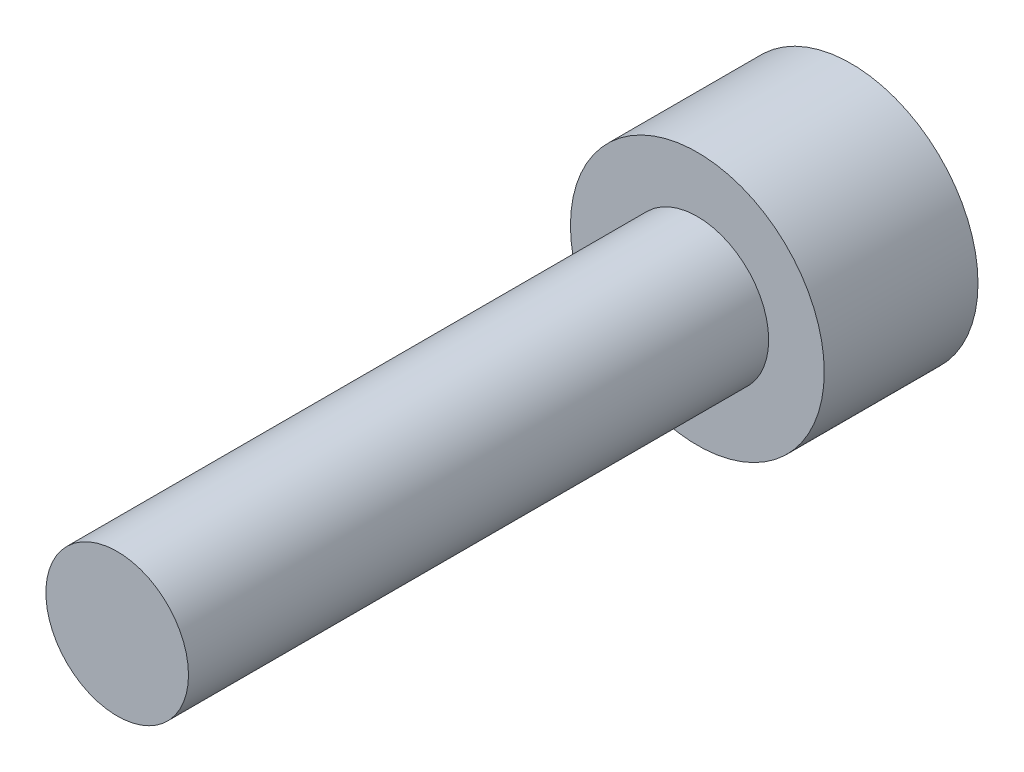
ISO-10303-21;
HEADER;
FILE_DESCRIPTION(('STEP AP214'),'2;1');
FILE_NAME('part.step','',(''),(''),'','','');
FILE_SCHEMA(('AUTOMOTIVE_DESIGN { 1 0 10303 214 1 1 1 1 }'));
ENDSEC;
DATA;
#1=APPLICATION_CONTEXT('core data for automotive mechanical design processes');
#2=APPLICATION_PROTOCOL_DEFINITION('international standard','automotive_design',2000,#1);
#3=PRODUCT_CONTEXT('',#1,'mechanical');
#4=PRODUCT('Part','Part','',(#3));
#5=PRODUCT_RELATED_PRODUCT_CATEGORY('part','',(#4));
#6=PRODUCT_DEFINITION_FORMATION('','',#4);
#7=PRODUCT_DEFINITION_CONTEXT('part definition',#1,'design');
#8=PRODUCT_DEFINITION('design','',#6,#7);
#9=PRODUCT_DEFINITION_SHAPE('','',#8);
#10=(LENGTH_UNIT() NAMED_UNIT(*) SI_UNIT(.MILLI.,.METRE.));
#11=(NAMED_UNIT(*) PLANE_ANGLE_UNIT() SI_UNIT($,.RADIAN.));
#12=(NAMED_UNIT(*) SI_UNIT($,.STERADIAN.) SOLID_ANGLE_UNIT());
#13=UNCERTAINTY_MEASURE_WITH_UNIT(LENGTH_MEASURE(1.E-05),#10,'distance_accuracy_value','');
#14=(GEOMETRIC_REPRESENTATION_CONTEXT(3) GLOBAL_UNCERTAINTY_ASSIGNED_CONTEXT((#13)) GLOBAL_UNIT_ASSIGNED_CONTEXT((#10,
#11,#12)) REPRESENTATION_CONTEXT('',''));
#15=CARTESIAN_POINT('',(0.,0.,0.));
#16=DIRECTION('',(0.,0.,1.));
#17=DIRECTION('',(1.,0.,0.));
#18=AXIS2_PLACEMENT_3D('',#15,#16,#17);
#19=CARTESIAN_POINT('',(0.,0.,3.18));
#20=DIRECTION('',(0.,0.,-1.));
#21=DIRECTION('',(-1.,0.,0.));
#22=AXIS2_PLACEMENT_3D('',#19,#20,#21);
#23=CYLINDRICAL_SURFACE('',#22,2.625);
#24=CARTESIAN_POINT('',(0.,0.,3.18));
#25=DIRECTION('',(0.,0.,1.));
#26=DIRECTION('',(1.,0.,0.));
#27=AXIS2_PLACEMENT_3D('',#24,#25,#26);
#28=CIRCLE('',#27,2.625);
#29=CARTESIAN_POINT('',(-2.625,0.,3.18));
#30=VERTEX_POINT('',#29);
#31=EDGE_CURVE('E42',#30,#30,#28,.T.);
#32=CARTESIAN_POINT('',(0.,0.,0.));
#33=DIRECTION('',(0.,0.,1.));
#34=DIRECTION('',(1.,0.,0.));
#35=AXIS2_PLACEMENT_3D('',#32,#33,#34);
#36=CIRCLE('',#35,2.625);
#37=CARTESIAN_POINT('',(-2.625,0.,0.));
#38=VERTEX_POINT('',#37);
#39=EDGE_CURVE('E38',#38,#38,#36,.T.);
#40=CARTESIAN_POINT('',(-2.625,0.,3.18));
#41=CARTESIAN_POINT('',(-2.625,0.,3.146875));
#42=CARTESIAN_POINT('',(-2.625,0.,3.11375));
#43=CARTESIAN_POINT('',(-2.625,0.,3.0475));
#44=CARTESIAN_POINT('',(-2.625,0.,3.014375));
#45=CARTESIAN_POINT('',(-2.625,0.,2.948125));
#46=CARTESIAN_POINT('',(-2.625,0.,2.915));
#47=CARTESIAN_POINT('',(-2.625,0.,2.84875));
#48=CARTESIAN_POINT('',(-2.625,0.,2.815625));
#49=CARTESIAN_POINT('',(-2.625,0.,2.749375));
#50=CARTESIAN_POINT('',(-2.625,0.,2.71625));
#51=CARTESIAN_POINT('',(-2.625,0.,2.65));
#52=CARTESIAN_POINT('',(-2.625,0.,2.616875));
#53=CARTESIAN_POINT('',(-2.625,0.,2.550625));
#54=CARTESIAN_POINT('',(-2.625,0.,2.5175));
#55=CARTESIAN_POINT('',(-2.625,0.,2.45125));
#56=CARTESIAN_POINT('',(-2.625,0.,2.418125));
#57=CARTESIAN_POINT('',(-2.625,0.,2.351875));
#58=CARTESIAN_POINT('',(-2.625,0.,2.31875));
#59=CARTESIAN_POINT('',(-2.625,0.,2.2525));
#60=CARTESIAN_POINT('',(-2.625,0.,2.219375));
#61=CARTESIAN_POINT('',(-2.625,0.,2.153125));
#62=CARTESIAN_POINT('',(-2.625,0.,2.12));
#63=CARTESIAN_POINT('',(-2.625,0.,2.05375));
#64=CARTESIAN_POINT('',(-2.625,0.,2.020625));
#65=CARTESIAN_POINT('',(-2.625,0.,1.954375));
#66=CARTESIAN_POINT('',(-2.625,0.,1.92125));
#67=CARTESIAN_POINT('',(-2.625,0.,1.855));
#68=CARTESIAN_POINT('',(-2.625,0.,1.821875));
#69=CARTESIAN_POINT('',(-2.625,0.,1.755625));
#70=CARTESIAN_POINT('',(-2.625,0.,1.7225));
#71=CARTESIAN_POINT('',(-2.625,0.,1.65625));
#72=CARTESIAN_POINT('',(-2.625,0.,1.623125));
#73=CARTESIAN_POINT('',(-2.625,0.,1.556875));
#74=CARTESIAN_POINT('',(-2.625,0.,1.52375));
#75=CARTESIAN_POINT('',(-2.625,0.,1.4575));
#76=CARTESIAN_POINT('',(-2.625,0.,1.424375));
#77=CARTESIAN_POINT('',(-2.625,0.,1.358125));
#78=CARTESIAN_POINT('',(-2.625,0.,1.325));
#79=CARTESIAN_POINT('',(-2.625,0.,1.25875));
#80=CARTESIAN_POINT('',(-2.625,0.,1.225625));
#81=CARTESIAN_POINT('',(-2.625,0.,1.159375));
#82=CARTESIAN_POINT('',(-2.625,0.,1.12625));
#83=CARTESIAN_POINT('',(-2.625,0.,1.06));
#84=CARTESIAN_POINT('',(-2.625,0.,1.026875));
#85=CARTESIAN_POINT('',(-2.625,0.,0.960625));
#86=CARTESIAN_POINT('',(-2.625,0.,0.9275));
#87=CARTESIAN_POINT('',(-2.625,0.,0.86125));
#88=CARTESIAN_POINT('',(-2.625,0.,0.828125));
#89=CARTESIAN_POINT('',(-2.625,0.,0.761875));
#90=CARTESIAN_POINT('',(-2.625,0.,0.72875));
#91=CARTESIAN_POINT('',(-2.625,0.,0.6625));
#92=CARTESIAN_POINT('',(-2.625,0.,0.629375));
#93=CARTESIAN_POINT('',(-2.625,0.,0.563125));
#94=CARTESIAN_POINT('',(-2.625,0.,0.53));
#95=CARTESIAN_POINT('',(-2.625,0.,0.46375));
#96=CARTESIAN_POINT('',(-2.625,0.,0.430625));
#97=CARTESIAN_POINT('',(-2.625,0.,0.364375));
#98=CARTESIAN_POINT('',(-2.625,0.,0.33125));
#99=CARTESIAN_POINT('',(-2.625,0.,0.265));
#100=CARTESIAN_POINT('',(-2.625,0.,0.231875));
#101=CARTESIAN_POINT('',(-2.625,0.,0.165625));
#102=CARTESIAN_POINT('',(-2.625,0.,0.1325));
#103=CARTESIAN_POINT('',(-2.625,0.,0.06625));
#104=CARTESIAN_POINT('',(-2.625,0.,0.033125));
#105=CARTESIAN_POINT('',(-2.625,0.,0.));
#106=B_SPLINE_CURVE_WITH_KNOTS('',3,(#40,#41,#42,#43,#44,#45,#46,#47,#48,#49,#50,#51,#52,#53,
#54,#55,#56,#57,#58,#59,#60,#61,#62,#63,#64,#65,#66,#67,#68,#69,#70,#71,#72,#73,#74,#75,#76,#77,
#78,#79,#80,#81,#82,#83,#84,#85,#86,#87,#88,#89,#90,#91,#92,#93,#94,#95,#96,#97,#98,#99,#100,
#101,#102,#103,#104,#105),.UNSPECIFIED.,.F.,.F.,(4,2,2,2,2,2,2,2,2,2,2,2,2,2,2,2,2,2,2,2,2,2,2,
2,2,2,2,2,2,2,2,2,4),(0.,0.0993749999999996,0.19875,0.298125,0.3975,0.496875,0.59625,0.695625,
0.795,0.894375,0.99375,1.093125,1.1925,1.291875,1.39125,1.490625,1.59,1.689375,1.78875,1.888125,
1.9875,2.086875,2.18625,2.285625,2.385,2.484375,2.58375,2.683125,2.7825,2.881875,2.98125,
3.080625,3.18),.UNSPECIFIED.);
#107=EDGE_CURVE('BSEAM35',#30,#38,#106,.T.);
#108=ORIENTED_EDGE('',*,*,#31,.F.);
#109=ORIENTED_EDGE('',*,*,#39,.T.);
#110=ORIENTED_EDGE('',*,*,#107,.T.);
#111=ORIENTED_EDGE('',*,*,#107,.F.);
#112=EDGE_LOOP('',(#108,#110,#109,#111));
#113=FACE_BOUND('',#112,.T.);
#114=ADVANCED_FACE('F35',(#113),#23,.T.);
#115=CARTESIAN_POINT('',(0.,0.,3.18));
#116=DIRECTION('',(0.,0.,1.));
#117=DIRECTION('',(1.,0.,0.));
#118=AXIS2_PLACEMENT_3D('',#115,#116,#117);
#119=PLANE('',#118);
#120=CARTESIAN_POINT('',(0.,0.,3.18));
#121=DIRECTION('',(0.,0.,1.));
#122=DIRECTION('',(1.,0.,0.));
#123=AXIS2_PLACEMENT_3D('',#120,#121,#122);
#124=CIRCLE('',#123,1.475);
#125=CARTESIAN_POINT('',(1.475,0.,3.18));
#126=VERTEX_POINT('',#125);
#127=EDGE_CURVE('E10',#126,#126,#124,.T.);
#128=ORIENTED_EDGE('',*,*,#127,.F.);
#129=EDGE_LOOP('',(#128));
#130=FACE_BOUND('',#129,.T.);
#131=ORIENTED_EDGE('',*,*,#31,.T.);
#132=EDGE_LOOP('',(#131));
#133=FACE_BOUND('',#132,.T.);
#134=ADVANCED_FACE('F59',(#130,#133),#119,.T.);
#135=CARTESIAN_POINT('',(0.,0.,0.));
#136=DIRECTION('',(0.,0.,1.));
#137=DIRECTION('',(1.,0.,0.));
#138=AXIS2_PLACEMENT_3D('',#135,#136,#137);
#139=PLANE('',#138);
#140=ORIENTED_EDGE('',*,*,#39,.F.);
#141=EDGE_LOOP('',(#140));
#142=FACE_BOUND('',#141,.T.);
#143=ADVANCED_FACE('F56',(#142),#139,.F.);
#144=CARTESIAN_POINT('',(0.,0.,15.18));
#145=DIRECTION('',(0.,0.,-1.));
#146=DIRECTION('',(-1.,0.,0.));
#147=AXIS2_PLACEMENT_3D('',#144,#145,#146);
#148=CYLINDRICAL_SURFACE('',#147,1.475);
#149=CARTESIAN_POINT('',(0.,0.,15.18));
#150=DIRECTION('',(0.,0.,1.));
#151=DIRECTION('',(1.,0.,0.));
#152=AXIS2_PLACEMENT_3D('',#149,#150,#151);
#153=CIRCLE('',#152,1.475);
#154=CARTESIAN_POINT('',(1.475,0.,15.18));
#155=VERTEX_POINT('',#154);
#156=EDGE_CURVE('E48',#155,#155,#153,.T.);
#157=ORIENTED_EDGE('',*,*,#156,.F.);
#158=EDGE_LOOP('',(#157));
#159=FACE_BOUND('',#158,.T.);
#160=ORIENTED_EDGE('',*,*,#127,.T.);
#161=EDGE_LOOP('',(#160));
#162=FACE_BOUND('',#161,.T.);
#163=ADVANCED_FACE('F58',(#159,#162),#148,.T.);
#164=CARTESIAN_POINT('',(0.,0.,15.18));
#165=DIRECTION('',(0.,0.,1.));
#166=DIRECTION('',(1.,0.,0.));
#167=AXIS2_PLACEMENT_3D('',#164,#165,#166);
#168=PLANE('',#167);
#169=ORIENTED_EDGE('',*,*,#156,.T.);
#170=EDGE_LOOP('',(#169));
#171=FACE_BOUND('',#170,.T.);
#172=ADVANCED_FACE('F64',(#171),#168,.T.);
#173=CLOSED_SHELL('',(#114,#134,#143,#163,#172));
#174=MANIFOLD_SOLID_BREP('B2',#173);
#175=ADVANCED_BREP_SHAPE_REPRESENTATION('',(#18,#174),#14);
#176=SHAPE_DEFINITION_REPRESENTATION(#9,#175);
ENDSEC;
END-ISO-10303-21;
